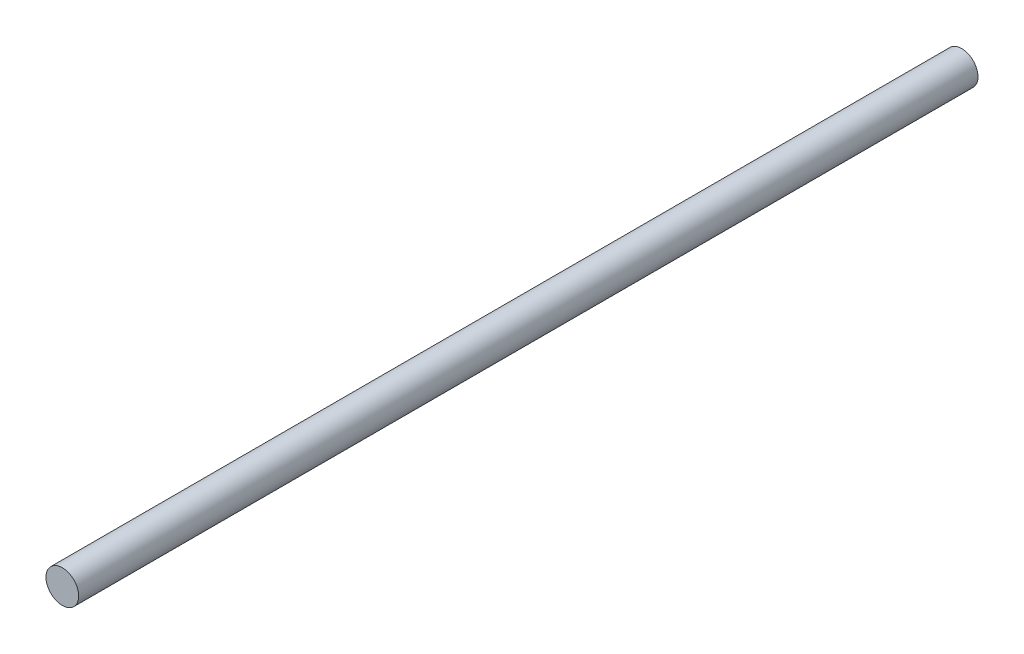
ISO-10303-21;
HEADER;
FILE_DESCRIPTION(('STEP AP214'),'2;1');
FILE_NAME('part.step','',(''),(''),'','','');
FILE_SCHEMA(('AUTOMOTIVE_DESIGN { 1 0 10303 214 1 1 1 1 }'));
ENDSEC;
DATA;
#1=APPLICATION_CONTEXT('core data for automotive mechanical design processes');
#2=APPLICATION_PROTOCOL_DEFINITION('international standard','automotive_design',2000,#1);
#3=PRODUCT_CONTEXT('',#1,'mechanical');
#4=PRODUCT('Part','Part','',(#3));
#5=PRODUCT_RELATED_PRODUCT_CATEGORY('part','',(#4));
#6=PRODUCT_DEFINITION_FORMATION('','',#4);
#7=PRODUCT_DEFINITION_CONTEXT('part definition',#1,'design');
#8=PRODUCT_DEFINITION('design','',#6,#7);
#9=PRODUCT_DEFINITION_SHAPE('','',#8);
#10=(LENGTH_UNIT() NAMED_UNIT(*) SI_UNIT(.MILLI.,.METRE.));
#11=(NAMED_UNIT(*) PLANE_ANGLE_UNIT() SI_UNIT($,.RADIAN.));
#12=(NAMED_UNIT(*) SI_UNIT($,.STERADIAN.) SOLID_ANGLE_UNIT());
#13=UNCERTAINTY_MEASURE_WITH_UNIT(LENGTH_MEASURE(1.E-05),#10,'distance_accuracy_value','');
#14=(GEOMETRIC_REPRESENTATION_CONTEXT(3) GLOBAL_UNCERTAINTY_ASSIGNED_CONTEXT((#13)) GLOBAL_UNIT_ASSIGNED_CONTEXT((#10,
#11,#12)) REPRESENTATION_CONTEXT('',''));
#15=CARTESIAN_POINT('',(0.,0.,0.));
#16=DIRECTION('',(0.,0.,1.));
#17=DIRECTION('',(1.,0.,0.));
#18=AXIS2_PLACEMENT_3D('',#15,#16,#17);
#19=CARTESIAN_POINT('',(-5.98713688873571,4.96448928351687,220.));
#20=DIRECTION('',(0.,0.,-1.));
#21=DIRECTION('',(-1.,0.,0.));
#22=AXIS2_PLACEMENT_3D('',#19,#20,#21);
#23=CYLINDRICAL_SURFACE('',#22,4.);
#24=CARTESIAN_POINT('',(-5.98713688873571,4.96448928351687,220.));
#25=DIRECTION('',(0.,0.,1.));
#26=DIRECTION('',(1.,0.,0.));
#27=AXIS2_PLACEMENT_3D('',#24,#25,#26);
#28=CIRCLE('',#27,4.);
#29=CARTESIAN_POINT('',(-1.98713688873571,4.96448928351687,220.));
#30=VERTEX_POINT('',#29);
#31=EDGE_CURVE('E10',#30,#30,#28,.T.);
#32=ORIENTED_EDGE('',*,*,#31,.F.);
#33=EDGE_LOOP('',(#32));
#34=FACE_BOUND('',#33,.T.);
#35=CARTESIAN_POINT('',(-5.98713688873571,4.96448928351687,0.));
#36=DIRECTION('',(0.,0.,1.));
#37=DIRECTION('',(1.,0.,0.));
#38=AXIS2_PLACEMENT_3D('',#35,#36,#37);
#39=CIRCLE('',#38,4.);
#40=CARTESIAN_POINT('',(-1.98713688873571,4.96448928351687,0.));
#41=VERTEX_POINT('',#40);
#42=EDGE_CURVE('E34',#41,#41,#39,.T.);
#43=ORIENTED_EDGE('',*,*,#42,.T.);
#44=EDGE_LOOP('',(#43));
#45=FACE_BOUND('',#44,.T.);
#46=ADVANCED_FACE('F31',(#34,#45),#23,.T.);
#47=CARTESIAN_POINT('',(-5.98713688873571,4.96448928351687,220.));
#48=DIRECTION('',(0.,0.,1.));
#49=DIRECTION('',(1.,0.,0.));
#50=AXIS2_PLACEMENT_3D('',#47,#48,#49);
#51=PLANE('',#50);
#52=ORIENTED_EDGE('',*,*,#31,.T.);
#53=EDGE_LOOP('',(#52));
#54=FACE_BOUND('',#53,.T.);
#55=ADVANCED_FACE('F46',(#54),#51,.T.);
#56=CARTESIAN_POINT('',(-5.98713688873571,4.96448928351687,0.));
#57=DIRECTION('',(0.,0.,1.));
#58=DIRECTION('',(1.,0.,0.));
#59=AXIS2_PLACEMENT_3D('',#56,#57,#58);
#60=PLANE('',#59);
#61=ORIENTED_EDGE('',*,*,#42,.F.);
#62=EDGE_LOOP('',(#61));
#63=FACE_BOUND('',#62,.T.);
#64=ADVANCED_FACE('F44',(#63),#60,.F.);
#65=CLOSED_SHELL('',(#46,#55,#64));
#66=MANIFOLD_SOLID_BREP('B2',#65);
#67=ADVANCED_BREP_SHAPE_REPRESENTATION('',(#18,#66),#14);
#68=SHAPE_DEFINITION_REPRESENTATION(#9,#67);
ENDSEC;
END-ISO-10303-21;
